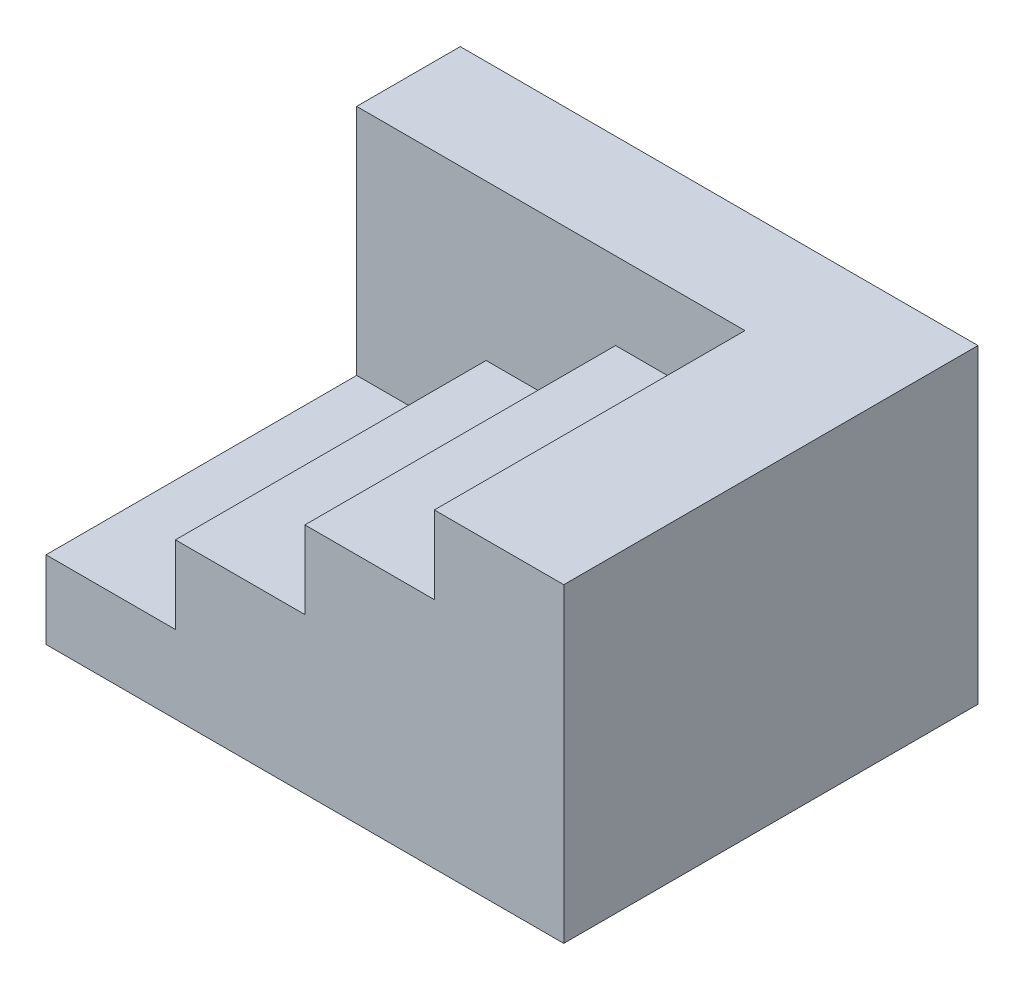
ISO-10303-21;
HEADER;
FILE_DESCRIPTION(('STEP AP214'),'2;1');
FILE_NAME('part.step','',(''),(''),'','','');
FILE_SCHEMA(('AUTOMOTIVE_DESIGN { 1 0 10303 214 1 1 1 1 }'));
ENDSEC;
DATA;
#1=APPLICATION_CONTEXT('core data for automotive mechanical design processes');
#2=APPLICATION_PROTOCOL_DEFINITION('international standard','automotive_design',2000,#1);
#3=PRODUCT_CONTEXT('',#1,'mechanical');
#4=PRODUCT('Part','Part','',(#3));
#5=PRODUCT_RELATED_PRODUCT_CATEGORY('part','',(#4));
#6=PRODUCT_DEFINITION_FORMATION('','',#4);
#7=PRODUCT_DEFINITION_CONTEXT('part definition',#1,'design');
#8=PRODUCT_DEFINITION('design','',#6,#7);
#9=PRODUCT_DEFINITION_SHAPE('','',#8);
#10=(LENGTH_UNIT() NAMED_UNIT(*) SI_UNIT(.MILLI.,.METRE.));
#11=(NAMED_UNIT(*) PLANE_ANGLE_UNIT() SI_UNIT($,.RADIAN.));
#12=(NAMED_UNIT(*) SI_UNIT($,.STERADIAN.) SOLID_ANGLE_UNIT());
#13=UNCERTAINTY_MEASURE_WITH_UNIT(LENGTH_MEASURE(1.E-05),#10,'distance_accuracy_value','');
#14=(GEOMETRIC_REPRESENTATION_CONTEXT(3) GLOBAL_UNCERTAINTY_ASSIGNED_CONTEXT((#13)) GLOBAL_UNIT_ASSIGNED_CONTEXT((#10,
#11,#12)) REPRESENTATION_CONTEXT('',''));
#15=CARTESIAN_POINT('',(0.,0.,0.));
#16=DIRECTION('',(0.,0.,1.));
#17=DIRECTION('',(1.,0.,0.));
#18=AXIS2_PLACEMENT_3D('',#15,#16,#17);
#19=CARTESIAN_POINT('',(0.,0.,0.));
#20=DIRECTION('',(0.,1.,0.));
#21=DIRECTION('',(0.,0.,1.));
#22=AXIS2_PLACEMENT_3D('',#19,#20,#21);
#23=PLANE('',#22);
#24=DIRECTION('',(-1.,0.,0.));
#25=VECTOR('',#24,1.);
#26=CARTESIAN_POINT('',(-64.7044417899686,0.,-25.1457711652275));
#27=LINE('',#26,#25);
#28=CARTESIAN_POINT('',(10.2955582100314,0.,-25.1457711652275));
#29=VERTEX_POINT('',#28);
#30=CARTESIAN_POINT('',(-64.7044417899686,0.,-25.1457711652275));
#31=VERTEX_POINT('',#30);
#32=EDGE_CURVE('E143',#29,#31,#27,.T.);
#33=ORIENTED_EDGE('',*,*,#32,.F.);
#34=DIRECTION('',(0.,0.,1.));
#35=VECTOR('',#34,1.);
#36=CARTESIAN_POINT('',(10.2955582100314,0.,-25.1457711652275));
#37=LINE('',#36,#35);
#38=CARTESIAN_POINT('',(10.2955582100314,0.,34.8542288347725));
#39=VERTEX_POINT('',#38);
#40=EDGE_CURVE('E166',#29,#39,#37,.T.);
#41=ORIENTED_EDGE('',*,*,#40,.T.);
#42=DIRECTION('',(1.,0.,0.));
#43=VECTOR('',#42,1.);
#44=CARTESIAN_POINT('',(-64.7044417899686,0.,34.8542288347725));
#45=LINE('',#44,#43);
#46=CARTESIAN_POINT('',(35.2955582100314,0.,34.8542288347725));
#47=VERTEX_POINT('',#46);
#48=EDGE_CURVE('E167',#39,#47,#45,.T.);
#49=ORIENTED_EDGE('',*,*,#48,.T.);
#50=DIRECTION('',(0.,0.,-1.));
#51=VECTOR('',#50,1.);
#52=CARTESIAN_POINT('',(35.2955582100314,0.,-45.1457711652275));
#53=LINE('',#52,#51);
#54=CARTESIAN_POINT('',(35.2955582100314,0.,-45.1457711652275));
#55=VERTEX_POINT('',#54);
#56=EDGE_CURVE('E169',#47,#55,#53,.T.);
#57=ORIENTED_EDGE('',*,*,#56,.T.);
#58=DIRECTION('',(-1.,0.,0.));
#59=VECTOR('',#58,1.);
#60=CARTESIAN_POINT('',(-64.7044417899686,0.,-45.1457711652275));
#61=LINE('',#60,#59);
#62=CARTESIAN_POINT('',(-64.7044417899686,0.,-45.1457711652275));
#63=VERTEX_POINT('',#62);
#64=EDGE_CURVE('E156',#55,#63,#61,.T.);
#65=ORIENTED_EDGE('',*,*,#64,.T.);
#66=DIRECTION('',(0.,0.,1.));
#67=VECTOR('',#66,1.);
#68=CARTESIAN_POINT('',(-64.7044417899686,0.,-45.1457711652275));
#69=LINE('',#68,#67);
#70=EDGE_CURVE('E164',#63,#31,#69,.T.);
#71=ORIENTED_EDGE('',*,*,#70,.T.);
#72=EDGE_LOOP('',(#33,#41,#49,#57,#65,#71));
#73=FACE_BOUND('',#72,.T.);
#74=ADVANCED_FACE('F39',(#73),#23,.T.);
#75=CARTESIAN_POINT('',(-64.7044417899686,-60.,-45.1457711652275));
#76=DIRECTION('',(-1.,0.,0.));
#77=DIRECTION('',(0.,0.,1.));
#78=AXIS2_PLACEMENT_3D('',#75,#76,#77);
#79=PLANE('',#78);
#80=DIRECTION('',(0.,-1.,0.));
#81=VECTOR('',#80,1.);
#82=CARTESIAN_POINT('',(-64.7044417899686,-45.,-25.1457711652275));
#83=LINE('',#82,#81);
#84=CARTESIAN_POINT('',(-64.7044417899686,-45.,-25.1457711652275));
#85=VERTEX_POINT('',#84);
#86=EDGE_CURVE('E138',#31,#85,#83,.T.);
#87=ORIENTED_EDGE('',*,*,#86,.F.);
#88=ORIENTED_EDGE('',*,*,#70,.F.);
#89=DIRECTION('',(0.,1.,0.));
#90=VECTOR('',#89,1.);
#91=CARTESIAN_POINT('',(-64.7044417899686,-60.,-45.1457711652275));
#92=LINE('',#91,#90);
#93=CARTESIAN_POINT('',(-64.7044417899686,-60.,-45.1457711652275));
#94=VERTEX_POINT('',#93);
#95=EDGE_CURVE('E11',#94,#63,#92,.T.);
#96=ORIENTED_EDGE('',*,*,#95,.F.);
#97=DIRECTION('',(0.,0.,1.));
#98=VECTOR('',#97,1.);
#99=CARTESIAN_POINT('',(-64.7044417899686,-60.,-45.1457711652275));
#100=LINE('',#99,#98);
#101=CARTESIAN_POINT('',(-64.7044417899686,-60.,34.8542288347725));
#102=VERTEX_POINT('',#101);
#103=EDGE_CURVE('E154',#94,#102,#100,.T.);
#104=ORIENTED_EDGE('',*,*,#103,.T.);
#105=DIRECTION('',(0.,1.,0.));
#106=VECTOR('',#105,1.);
#107=CARTESIAN_POINT('',(-64.7044417899686,-60.,34.8542288347725));
#108=LINE('',#107,#106);
#109=CARTESIAN_POINT('',(-64.7044417899686,-45.,34.8542288347725));
#110=VERTEX_POINT('',#109);
#111=EDGE_CURVE('E43',#102,#110,#108,.T.);
#112=ORIENTED_EDGE('',*,*,#111,.T.);
#113=DIRECTION('',(0.,0.,1.));
#114=VECTOR('',#113,1.);
#115=CARTESIAN_POINT('',(-64.7044417899686,-45.,-25.1457711652275));
#116=LINE('',#115,#114);
#117=EDGE_CURVE('E135',#85,#110,#116,.T.);
#118=ORIENTED_EDGE('',*,*,#117,.F.);
#119=EDGE_LOOP('',(#87,#88,#96,#104,#112,#118));
#120=FACE_BOUND('',#119,.T.);
#121=ADVANCED_FACE('F41',(#120),#79,.T.);
#122=CARTESIAN_POINT('',(-64.7044417899686,-60.,-45.1457711652275));
#123=DIRECTION('',(0.,0.,-1.));
#124=DIRECTION('',(-1.,0.,0.));
#125=AXIS2_PLACEMENT_3D('',#122,#123,#124);
#126=PLANE('',#125);
#127=ORIENTED_EDGE('',*,*,#64,.F.);
#128=DIRECTION('',(0.,1.,0.));
#129=VECTOR('',#128,1.);
#130=CARTESIAN_POINT('',(35.2955582100314,-60.,-45.1457711652275));
#131=LINE('',#130,#129);
#132=CARTESIAN_POINT('',(35.2955582100314,-60.,-45.1457711652275));
#133=VERTEX_POINT('',#132);
#134=EDGE_CURVE('E48',#133,#55,#131,.T.);
#135=ORIENTED_EDGE('',*,*,#134,.F.);
#136=DIRECTION('',(-1.,0.,0.));
#137=VECTOR('',#136,1.);
#138=CARTESIAN_POINT('',(-64.7044417899686,-60.,-45.1457711652275));
#139=LINE('',#138,#137);
#140=EDGE_CURVE('E161',#133,#94,#139,.T.);
#141=ORIENTED_EDGE('',*,*,#140,.T.);
#142=ORIENTED_EDGE('',*,*,#95,.T.);
#143=EDGE_LOOP('',(#127,#135,#141,#142));
#144=FACE_BOUND('',#143,.T.);
#145=ADVANCED_FACE('F186',(#144),#126,.T.);
#146=CARTESIAN_POINT('',(35.2955582100314,-60.,-45.1457711652275));
#147=DIRECTION('',(1.,0.,0.));
#148=DIRECTION('',(0.,0.,-1.));
#149=AXIS2_PLACEMENT_3D('',#146,#147,#148);
#150=PLANE('',#149);
#151=ORIENTED_EDGE('',*,*,#56,.F.);
#152=DIRECTION('',(0.,1.,0.));
#153=VECTOR('',#152,1.);
#154=CARTESIAN_POINT('',(35.2955582100314,-60.,34.8542288347725));
#155=LINE('',#154,#153);
#156=CARTESIAN_POINT('',(35.2955582100314,-60.,34.8542288347725));
#157=VERTEX_POINT('',#156);
#158=EDGE_CURVE('E172',#157,#47,#155,.T.);
#159=ORIENTED_EDGE('',*,*,#158,.F.);
#160=DIRECTION('',(0.,0.,-1.));
#161=VECTOR('',#160,1.);
#162=CARTESIAN_POINT('',(35.2955582100314,-60.,-45.1457711652275));
#163=LINE('',#162,#161);
#164=EDGE_CURVE('E158',#157,#133,#163,.T.);
#165=ORIENTED_EDGE('',*,*,#164,.T.);
#166=ORIENTED_EDGE('',*,*,#134,.T.);
#167=EDGE_LOOP('',(#151,#159,#165,#166));
#168=FACE_BOUND('',#167,.T.);
#169=ADVANCED_FACE('F183',(#168),#150,.T.);
#170=CARTESIAN_POINT('',(-64.7044417899686,-60.,34.8542288347725));
#171=DIRECTION('',(0.,0.,1.));
#172=DIRECTION('',(1.,0.,0.));
#173=AXIS2_PLACEMENT_3D('',#170,#171,#172);
#174=PLANE('',#173);
#175=DIRECTION('',(1.,0.,0.));
#176=VECTOR('',#175,1.);
#177=CARTESIAN_POINT('',(-39.7044417899686,-45.,34.8542288347725));
#178=LINE('',#177,#176);
#179=CARTESIAN_POINT('',(-39.7044417899686,-45.,34.8542288347725));
#180=VERTEX_POINT('',#179);
#181=EDGE_CURVE('E57',#110,#180,#178,.T.);
#182=ORIENTED_EDGE('',*,*,#181,.F.);
#183=ORIENTED_EDGE('',*,*,#111,.F.);
#184=DIRECTION('',(1.,0.,0.));
#185=VECTOR('',#184,1.);
#186=CARTESIAN_POINT('',(-64.7044417899686,-60.,34.8542288347725));
#187=LINE('',#186,#185);
#188=EDGE_CURVE('E160',#102,#157,#187,.T.);
#189=ORIENTED_EDGE('',*,*,#188,.T.);
#190=ORIENTED_EDGE('',*,*,#158,.T.);
#191=ORIENTED_EDGE('',*,*,#48,.F.);
#192=DIRECTION('',(0.,1.,0.));
#193=VECTOR('',#192,1.);
#194=CARTESIAN_POINT('',(10.2955582100314,0.,34.8542288347725));
#195=LINE('',#194,#193);
#196=CARTESIAN_POINT('',(10.2955582100314,-15.,34.8542288347725));
#197=VERTEX_POINT('',#196);
#198=EDGE_CURVE('E147',#197,#39,#195,.T.);
#199=ORIENTED_EDGE('',*,*,#198,.F.);
#200=DIRECTION('',(1.,0.,0.));
#201=VECTOR('',#200,1.);
#202=CARTESIAN_POINT('',(10.2955582100314,-15.,34.8542288347725));
#203=LINE('',#202,#201);
#204=CARTESIAN_POINT('',(-14.7044417899686,-15.,34.8542288347725));
#205=VERTEX_POINT('',#204);
#206=EDGE_CURVE('E314',#205,#197,#203,.T.);
#207=ORIENTED_EDGE('',*,*,#206,.F.);
#208=DIRECTION('',(0.,1.,0.));
#209=VECTOR('',#208,1.);
#210=CARTESIAN_POINT('',(-14.7044417899686,-15.,34.8542288347725));
#211=LINE('',#210,#209);
#212=CARTESIAN_POINT('',(-14.7044417899686,-30.,34.8542288347725));
#213=VERTEX_POINT('',#212);
#214=EDGE_CURVE('E313',#213,#205,#211,.T.);
#215=ORIENTED_EDGE('',*,*,#214,.F.);
#216=DIRECTION('',(1.,0.,0.));
#217=VECTOR('',#216,1.);
#218=CARTESIAN_POINT('',(-14.7044417899686,-30.,34.8542288347725));
#219=LINE('',#218,#217);
#220=CARTESIAN_POINT('',(-39.7044417899686,-30.,34.8542288347725));
#221=VERTEX_POINT('',#220);
#222=EDGE_CURVE('E310',#221,#213,#219,.T.);
#223=ORIENTED_EDGE('',*,*,#222,.F.);
#224=DIRECTION('',(0.,1.,0.));
#225=VECTOR('',#224,1.);
#226=CARTESIAN_POINT('',(-39.7044417899686,-30.,34.8542288347725));
#227=LINE('',#226,#225);
#228=EDGE_CURVE('E305',#180,#221,#227,.T.);
#229=ORIENTED_EDGE('',*,*,#228,.F.);
#230=EDGE_LOOP('',(#182,#183,#189,#190,#191,#199,#207,#215,#223,#229));
#231=FACE_BOUND('',#230,.T.);
#232=ADVANCED_FACE('F177',(#231),#174,.T.);
#233=CARTESIAN_POINT('',(0.,-60.,0.));
#234=DIRECTION('',(0.,1.,0.));
#235=DIRECTION('',(0.,0.,1.));
#236=AXIS2_PLACEMENT_3D('',#233,#234,#235);
#237=PLANE('',#236);
#238=ORIENTED_EDGE('',*,*,#103,.F.);
#239=ORIENTED_EDGE('',*,*,#140,.F.);
#240=ORIENTED_EDGE('',*,*,#164,.F.);
#241=ORIENTED_EDGE('',*,*,#188,.F.);
#242=EDGE_LOOP('',(#238,#239,#240,#241));
#243=FACE_BOUND('',#242,.T.);
#244=ADVANCED_FACE('F188',(#243),#237,.F.);
#245=CARTESIAN_POINT('',(10.2955582100314,0.,-25.1457711652275));
#246=DIRECTION('',(1.,0.,0.));
#247=DIRECTION('',(0.,1.,0.));
#248=AXIS2_PLACEMENT_3D('',#245,#246,#247);
#249=PLANE('',#248);
#250=ORIENTED_EDGE('',*,*,#198,.T.);
#251=ORIENTED_EDGE('',*,*,#40,.F.);
#252=DIRECTION('',(0.,1.,0.));
#253=VECTOR('',#252,1.);
#254=CARTESIAN_POINT('',(10.2955582100314,0.,-25.1457711652275));
#255=LINE('',#254,#253);
#256=CARTESIAN_POINT('',(10.2955582100314,-15.,-25.1457711652275));
#257=VERTEX_POINT('',#256);
#258=EDGE_CURVE('E153',#257,#29,#255,.T.);
#259=ORIENTED_EDGE('',*,*,#258,.F.);
#260=DIRECTION('',(0.,0.,1.));
#261=VECTOR('',#260,1.);
#262=CARTESIAN_POINT('',(10.2955582100314,-15.,-25.1457711652275));
#263=LINE('',#262,#261);
#264=EDGE_CURVE('E322',#257,#197,#263,.T.);
#265=ORIENTED_EDGE('',*,*,#264,.T.);
#266=EDGE_LOOP('',(#250,#251,#259,#265));
#267=FACE_BOUND('',#266,.T.);
#268=ADVANCED_FACE('F192',(#267),#249,.F.);
#269=CARTESIAN_POINT('',(10.2955582100314,-15.,-25.1457711652275));
#270=DIRECTION('',(0.,-1.,0.));
#271=DIRECTION('',(1.,0.,0.));
#272=AXIS2_PLACEMENT_3D('',#269,#270,#271);
#273=PLANE('',#272);
#274=ORIENTED_EDGE('',*,*,#206,.T.);
#275=ORIENTED_EDGE('',*,*,#264,.F.);
#276=DIRECTION('',(1.,0.,0.));
#277=VECTOR('',#276,1.);
#278=CARTESIAN_POINT('',(10.2955582100314,-15.,-25.1457711652275));
#279=LINE('',#278,#277);
#280=CARTESIAN_POINT('',(-14.7044417899686,-15.,-25.1457711652275));
#281=VERTEX_POINT('',#280);
#282=EDGE_CURVE('E340',#281,#257,#279,.T.);
#283=ORIENTED_EDGE('',*,*,#282,.F.);
#284=DIRECTION('',(0.,0.,1.));
#285=VECTOR('',#284,1.);
#286=CARTESIAN_POINT('',(-14.7044417899686,-15.,-25.1457711652275));
#287=LINE('',#286,#285);
#288=EDGE_CURVE('E324',#281,#205,#287,.T.);
#289=ORIENTED_EDGE('',*,*,#288,.T.);
#290=EDGE_LOOP('',(#274,#275,#283,#289));
#291=FACE_BOUND('',#290,.T.);
#292=ADVANCED_FACE('F196',(#291),#273,.F.);
#293=CARTESIAN_POINT('',(-14.7044417899686,-15.,-25.1457711652275));
#294=DIRECTION('',(1.,0.,0.));
#295=DIRECTION('',(0.,1.,0.));
#296=AXIS2_PLACEMENT_3D('',#293,#294,#295);
#297=PLANE('',#296);
#298=ORIENTED_EDGE('',*,*,#214,.T.);
#299=ORIENTED_EDGE('',*,*,#288,.F.);
#300=DIRECTION('',(0.,1.,0.));
#301=VECTOR('',#300,1.);
#302=CARTESIAN_POINT('',(-14.7044417899686,-15.,-25.1457711652275));
#303=LINE('',#302,#301);
#304=CARTESIAN_POINT('',(-14.7044417899686,-30.,-25.1457711652275));
#305=VERTEX_POINT('',#304);
#306=EDGE_CURVE('E335',#305,#281,#303,.T.);
#307=ORIENTED_EDGE('',*,*,#306,.F.);
#308=DIRECTION('',(0.,0.,1.));
#309=VECTOR('',#308,1.);
#310=CARTESIAN_POINT('',(-14.7044417899686,-30.,-25.1457711652275));
#311=LINE('',#310,#309);
#312=EDGE_CURVE('E330',#305,#213,#311,.T.);
#313=ORIENTED_EDGE('',*,*,#312,.T.);
#314=EDGE_LOOP('',(#298,#299,#307,#313));
#315=FACE_BOUND('',#314,.T.);
#316=ADVANCED_FACE('F245',(#315),#297,.F.);
#317=CARTESIAN_POINT('',(-14.7044417899686,-30.,-25.1457711652275));
#318=DIRECTION('',(0.,-1.,0.));
#319=DIRECTION('',(1.,0.,0.));
#320=AXIS2_PLACEMENT_3D('',#317,#318,#319);
#321=PLANE('',#320);
#322=ORIENTED_EDGE('',*,*,#222,.T.);
#323=ORIENTED_EDGE('',*,*,#312,.F.);
#324=DIRECTION('',(1.,0.,0.));
#325=VECTOR('',#324,1.);
#326=CARTESIAN_POINT('',(-14.7044417899686,-30.,-25.1457711652275));
#327=LINE('',#326,#325);
#328=CARTESIAN_POINT('',(-39.7044417899686,-30.,-25.1457711652275));
#329=VERTEX_POINT('',#328);
#330=EDGE_CURVE('E326',#329,#305,#327,.T.);
#331=ORIENTED_EDGE('',*,*,#330,.F.);
#332=DIRECTION('',(0.,0.,1.));
#333=VECTOR('',#332,1.);
#334=CARTESIAN_POINT('',(-39.7044417899686,-30.,-25.1457711652275));
#335=LINE('',#334,#333);
#336=EDGE_CURVE('E146',#329,#221,#335,.T.);
#337=ORIENTED_EDGE('',*,*,#336,.T.);
#338=EDGE_LOOP('',(#322,#323,#331,#337));
#339=FACE_BOUND('',#338,.T.);
#340=ADVANCED_FACE('F253',(#339),#321,.F.);
#341=CARTESIAN_POINT('',(-39.7044417899686,-30.,-25.1457711652275));
#342=DIRECTION('',(1.,0.,0.));
#343=DIRECTION('',(0.,1.,0.));
#344=AXIS2_PLACEMENT_3D('',#341,#342,#343);
#345=PLANE('',#344);
#346=ORIENTED_EDGE('',*,*,#228,.T.);
#347=ORIENTED_EDGE('',*,*,#336,.F.);
#348=DIRECTION('',(0.,1.,0.));
#349=VECTOR('',#348,1.);
#350=CARTESIAN_POINT('',(-39.7044417899686,-30.,-25.1457711652275));
#351=LINE('',#350,#349);
#352=CARTESIAN_POINT('',(-39.7044417899686,-45.,-25.1457711652275));
#353=VERTEX_POINT('',#352);
#354=EDGE_CURVE('E140',#353,#329,#351,.T.);
#355=ORIENTED_EDGE('',*,*,#354,.F.);
#356=DIRECTION('',(0.,0.,1.));
#357=VECTOR('',#356,1.);
#358=CARTESIAN_POINT('',(-39.7044417899686,-45.,-25.1457711652275));
#359=LINE('',#358,#357);
#360=EDGE_CURVE('E133',#353,#180,#359,.T.);
#361=ORIENTED_EDGE('',*,*,#360,.T.);
#362=EDGE_LOOP('',(#346,#347,#355,#361));
#363=FACE_BOUND('',#362,.T.);
#364=ADVANCED_FACE('F259',(#363),#345,.F.);
#365=CARTESIAN_POINT('',(-39.7044417899686,-45.,-25.1457711652275));
#366=DIRECTION('',(0.,-1.,0.));
#367=DIRECTION('',(1.,0.,0.));
#368=AXIS2_PLACEMENT_3D('',#365,#366,#367);
#369=PLANE('',#368);
#370=ORIENTED_EDGE('',*,*,#181,.T.);
#371=ORIENTED_EDGE('',*,*,#360,.F.);
#372=DIRECTION('',(1.,0.,0.));
#373=VECTOR('',#372,1.);
#374=CARTESIAN_POINT('',(-39.7044417899686,-45.,-25.1457711652275));
#375=LINE('',#374,#373);
#376=EDGE_CURVE('E126',#85,#353,#375,.T.);
#377=ORIENTED_EDGE('',*,*,#376,.F.);
#378=ORIENTED_EDGE('',*,*,#117,.T.);
#379=EDGE_LOOP('',(#370,#371,#377,#378));
#380=FACE_BOUND('',#379,.T.);
#381=ADVANCED_FACE('F127',(#380),#369,.F.);
#382=CARTESIAN_POINT('',(0.,0.,-25.1457711652275));
#383=DIRECTION('',(0.,0.,-1.));
#384=DIRECTION('',(-1.,0.,0.));
#385=AXIS2_PLACEMENT_3D('',#382,#383,#384);
#386=PLANE('',#385);
#387=ORIENTED_EDGE('',*,*,#86,.T.);
#388=ORIENTED_EDGE('',*,*,#376,.T.);
#389=ORIENTED_EDGE('',*,*,#354,.T.);
#390=ORIENTED_EDGE('',*,*,#330,.T.);
#391=ORIENTED_EDGE('',*,*,#306,.T.);
#392=ORIENTED_EDGE('',*,*,#282,.T.);
#393=ORIENTED_EDGE('',*,*,#258,.T.);
#394=ORIENTED_EDGE('',*,*,#32,.T.);
#395=EDGE_LOOP('',(#387,#388,#389,#390,#391,#392,#393,#394));
#396=FACE_BOUND('',#395,.T.);
#397=ADVANCED_FACE('F141',(#396),#386,.F.);
#398=CLOSED_SHELL('',(#74,#121,#145,#169,#232,#244,#268,#292,#316,#340,#364,#381,#397));
#399=MANIFOLD_SOLID_BREP('B2',#398);
#400=ADVANCED_BREP_SHAPE_REPRESENTATION('',(#18,#399),#14);
#401=SHAPE_DEFINITION_REPRESENTATION(#9,#400);
ENDSEC;
END-ISO-10303-21;
